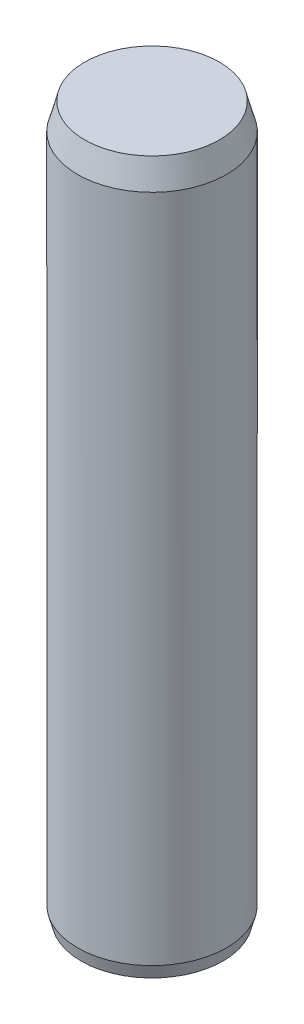
ISO-10303-21;
HEADER;
FILE_DESCRIPTION(('STEP AP214'),'2;1');
FILE_NAME('part.step','',(''),(''),'','','');
FILE_SCHEMA(('AUTOMOTIVE_DESIGN { 1 0 10303 214 1 1 1 1 }'));
ENDSEC;
DATA;
#1=APPLICATION_CONTEXT('core data for automotive mechanical design processes');
#2=APPLICATION_PROTOCOL_DEFINITION('international standard','automotive_design',2000,#1);
#3=PRODUCT_CONTEXT('',#1,'mechanical');
#4=PRODUCT('Part','Part','',(#3));
#5=PRODUCT_RELATED_PRODUCT_CATEGORY('part','',(#4));
#6=PRODUCT_DEFINITION_FORMATION('','',#4);
#7=PRODUCT_DEFINITION_CONTEXT('part definition',#1,'design');
#8=PRODUCT_DEFINITION('design','',#6,#7);
#9=PRODUCT_DEFINITION_SHAPE('','',#8);
#10=(LENGTH_UNIT() NAMED_UNIT(*) SI_UNIT(.MILLI.,.METRE.));
#11=(NAMED_UNIT(*) PLANE_ANGLE_UNIT() SI_UNIT($,.RADIAN.));
#12=(NAMED_UNIT(*) SI_UNIT($,.STERADIAN.) SOLID_ANGLE_UNIT());
#13=UNCERTAINTY_MEASURE_WITH_UNIT(LENGTH_MEASURE(1.E-05),#10,'distance_accuracy_value','');
#14=(GEOMETRIC_REPRESENTATION_CONTEXT(3) GLOBAL_UNCERTAINTY_ASSIGNED_CONTEXT((#13)) GLOBAL_UNIT_ASSIGNED_CONTEXT((#10,
#11,#12)) REPRESENTATION_CONTEXT('',''));
#15=CARTESIAN_POINT('',(0.,0.,0.));
#16=DIRECTION('',(0.,0.,1.));
#17=DIRECTION('',(1.,0.,0.));
#18=AXIS2_PLACEMENT_3D('',#15,#16,#17);
#19=CARTESIAN_POINT('',(0.,200.,0.));
#20=DIRECTION('',(0.,-1.,0.));
#21=DIRECTION('',(0.,0.,-1.));
#22=AXIS2_PLACEMENT_3D('',#19,#20,#21);
#23=CYLINDRICAL_SURFACE('',#22,21.);
#24=CARTESIAN_POINT('',(0.,3.73205080756916,0.));
#25=DIRECTION('',(0.,1.,0.));
#26=DIRECTION('',(0.,0.,1.));
#27=AXIS2_PLACEMENT_3D('',#24,#25,#26);
#28=CIRCLE('',#27,21.);
#29=CARTESIAN_POINT('',(0.,3.73205080756916,21.));
#30=VERTEX_POINT('',#29);
#31=EDGE_CURVE('E51',#30,#30,#28,.T.);
#32=ORIENTED_EDGE('',*,*,#31,.T.);
#33=EDGE_LOOP('',(#32));
#34=FACE_BOUND('',#33,.T.);
#35=CARTESIAN_POINT('',(0.,192.535898384862,0.));
#36=DIRECTION('',(0.,1.,0.));
#37=DIRECTION('',(0.,0.,1.));
#38=AXIS2_PLACEMENT_3D('',#35,#36,#37);
#39=CIRCLE('',#38,21.);
#40=CARTESIAN_POINT('',(0.,192.535898384862,-21.));
#41=VERTEX_POINT('',#40);
#42=EDGE_CURVE('E55',#41,#41,#39,.F.);
#43=ORIENTED_EDGE('',*,*,#42,.T.);
#44=EDGE_LOOP('',(#43));
#45=FACE_BOUND('',#44,.T.);
#46=ADVANCED_FACE('F43',(#34,#45),#23,.T.);
#47=CARTESIAN_POINT('',(0.,200.,0.));
#48=DIRECTION('',(0.,1.,0.));
#49=DIRECTION('',(0.,0.,1.));
#50=AXIS2_PLACEMENT_3D('',#47,#48,#49);
#51=PLANE('',#50);
#52=CARTESIAN_POINT('',(0.,200.,0.));
#53=DIRECTION('',(0.,1.,0.));
#54=DIRECTION('',(0.,0.,1.));
#55=AXIS2_PLACEMENT_3D('',#52,#53,#54);
#56=CIRCLE('',#55,19.);
#57=CARTESIAN_POINT('',(0.,200.,-19.));
#58=VERTEX_POINT('',#57);
#59=EDGE_CURVE('E59',#58,#58,#56,.T.);
#60=ORIENTED_EDGE('',*,*,#59,.T.);
#61=EDGE_LOOP('',(#60));
#62=FACE_BOUND('',#61,.T.);
#63=ADVANCED_FACE('F65',(#62),#51,.T.);
#64=CARTESIAN_POINT('',(0.,0.,0.));
#65=DIRECTION('',(0.,1.,0.));
#66=DIRECTION('',(0.,0.,1.));
#67=AXIS2_PLACEMENT_3D('',#64,#65,#66);
#68=PLANE('',#67);
#69=CARTESIAN_POINT('',(0.,0.,0.));
#70=DIRECTION('',(0.,1.,0.));
#71=DIRECTION('',(0.,0.,1.));
#72=AXIS2_PLACEMENT_3D('',#69,#70,#71);
#73=CIRCLE('',#72,19.9999999999999);
#74=CARTESIAN_POINT('',(0.,0.,19.9999999999999));
#75=VERTEX_POINT('',#74);
#76=EDGE_CURVE('E10',#75,#75,#73,.F.);
#77=ORIENTED_EDGE('',*,*,#76,.T.);
#78=EDGE_LOOP('',(#77));
#79=FACE_BOUND('',#78,.T.);
#80=ADVANCED_FACE('F69',(#79),#68,.F.);
#81=CARTESIAN_POINT('',(0.,200.,0.));
#82=DIRECTION('',(0.,-1.,0.));
#83=DIRECTION('',(0.,0.,-1.));
#84=AXIS2_PLACEMENT_3D('',#81,#82,#83);
#85=CONICAL_SURFACE('',#84,19.,0.261799387799146);
#86=CARTESIAN_POINT('',(0.,192.535898384862,-21.));
#87=CARTESIAN_POINT('',(0.,192.613649443353,-20.9791666666667));
#88=CARTESIAN_POINT('',(0.,192.691400501844,-20.9583333333333));
#89=CARTESIAN_POINT('',(0.,192.846902618826,-20.9166666666667));
#90=CARTESIAN_POINT('',(0.,192.924653677317,-20.8958333333333));
#91=CARTESIAN_POINT('',(0.,193.080155794299,-20.8541666666667));
#92=CARTESIAN_POINT('',(0.,193.15790685279,-20.8333333333333));
#93=CARTESIAN_POINT('',(0.,193.313408969772,-20.7916666666667));
#94=CARTESIAN_POINT('',(0.,193.391160028263,-20.7708333333333));
#95=CARTESIAN_POINT('',(0.,193.546662145245,-20.7291666666667));
#96=CARTESIAN_POINT('',(0.,193.624413203736,-20.7083333333333));
#97=CARTESIAN_POINT('',(0.,193.779915320719,-20.6666666666667));
#98=CARTESIAN_POINT('',(0.,193.85766637921,-20.6458333333333));
#99=CARTESIAN_POINT('',(0.,194.013168496192,-20.6041666666667));
#100=CARTESIAN_POINT('',(0.,194.090919554683,-20.5833333333333));
#101=CARTESIAN_POINT('',(0.,194.246421671665,-20.5416666666667));
#102=CARTESIAN_POINT('',(0.,194.324172730156,-20.5208333333333));
#103=CARTESIAN_POINT('',(0.,194.479674847138,-20.4791666666667));
#104=CARTESIAN_POINT('',(0.,194.557425905629,-20.4583333333333));
#105=CARTESIAN_POINT('',(0.,194.712928022611,-20.4166666666667));
#106=CARTESIAN_POINT('',(0.,194.790679081102,-20.3958333333333));
#107=CARTESIAN_POINT('',(0.,194.946181198084,-20.3541666666667));
#108=CARTESIAN_POINT('',(0.,195.023932256575,-20.3333333333333));
#109=CARTESIAN_POINT('',(0.,195.179434373557,-20.2916666666667));
#110=CARTESIAN_POINT('',(0.,195.257185432048,-20.2708333333333));
#111=CARTESIAN_POINT('',(0.,195.41268754903,-20.2291666666667));
#112=CARTESIAN_POINT('',(0.,195.490438607521,-20.2083333333333));
#113=CARTESIAN_POINT('',(0.,195.645940724503,-20.1666666666667));
#114=CARTESIAN_POINT('',(0.,195.723691782994,-20.1458333333333));
#115=CARTESIAN_POINT('',(0.,195.879193899976,-20.1041666666667));
#116=CARTESIAN_POINT('',(0.,195.956944958467,-20.0833333333333));
#117=CARTESIAN_POINT('',(0.,196.112447075449,-20.0416666666667));
#118=CARTESIAN_POINT('',(0.,196.19019813394,-20.0208333333333));
#119=CARTESIAN_POINT('',(0.,196.345700250922,-19.9791666666667));
#120=CARTESIAN_POINT('',(0.,196.423451309413,-19.9583333333334));
#121=CARTESIAN_POINT('',(0.,196.578953426395,-19.9166666666667));
#122=CARTESIAN_POINT('',(0.,196.656704484886,-19.8958333333333));
#123=CARTESIAN_POINT('',(0.,196.812206601868,-19.8541666666667));
#124=CARTESIAN_POINT('',(0.,196.889957660359,-19.8333333333334));
#125=CARTESIAN_POINT('',(0.,197.045459777341,-19.7916666666667));
#126=CARTESIAN_POINT('',(0.,197.123210835832,-19.7708333333334));
#127=CARTESIAN_POINT('',(0.,197.278712952814,-19.7291666666667));
#128=CARTESIAN_POINT('',(0.,197.356464011305,-19.7083333333334));
#129=CARTESIAN_POINT('',(0.,197.511966128287,-19.6666666666667));
#130=CARTESIAN_POINT('',(0.,197.589717186778,-19.6458333333334));
#131=CARTESIAN_POINT('',(0.,197.74521930376,-19.6041666666667));
#132=CARTESIAN_POINT('',(0.,197.822970362251,-19.5833333333334));
#133=CARTESIAN_POINT('',(0.,197.978472479234,-19.5416666666667));
#134=CARTESIAN_POINT('',(0.,198.056223537725,-19.5208333333334));
#135=CARTESIAN_POINT('',(0.,198.211725654707,-19.4791666666667));
#136=CARTESIAN_POINT('',(0.,198.289476713198,-19.4583333333334));
#137=CARTESIAN_POINT('',(0.,198.44497883018,-19.4166666666667));
#138=CARTESIAN_POINT('',(0.,198.522729888671,-19.3958333333334));
#139=CARTESIAN_POINT('',(0.,198.678232005653,-19.3541666666667));
#140=CARTESIAN_POINT('',(0.,198.755983064144,-19.3333333333334));
#141=CARTESIAN_POINT('',(0.,198.911485181126,-19.2916666666667));
#142=CARTESIAN_POINT('',(0.,198.989236239617,-19.2708333333334));
#143=CARTESIAN_POINT('',(0.,199.144738356599,-19.2291666666667));
#144=CARTESIAN_POINT('',(0.,199.22248941509,-19.2083333333334));
#145=CARTESIAN_POINT('',(0.,199.377991532072,-19.1666666666667));
#146=CARTESIAN_POINT('',(0.,199.455742590563,-19.1458333333334));
#147=CARTESIAN_POINT('',(0.,199.611244707545,-19.1041666666667));
#148=CARTESIAN_POINT('',(0.,199.688995766036,-19.0833333333334));
#149=CARTESIAN_POINT('',(0.,199.844497883018,-19.0416666666667));
#150=CARTESIAN_POINT('',(0.,199.922248941509,-19.0208333333334));
#151=CARTESIAN_POINT('',(0.,200.,-19.));
#152=B_SPLINE_CURVE_WITH_KNOTS('',3,(#86,#87,#88,#89,#90,#91,#92,#93,#94,#95,#96,#97,#98,#99,
#100,#101,#102,#103,#104,#105,#106,#107,#108,#109,#110,#111,#112,#113,#114,#115,#116,#117,#118,
#119,#120,#121,#122,#123,#124,#125,#126,#127,#128,#129,#130,#131,#132,#133,#134,#135,#136,#137,
#138,#139,#140,#141,#142,#143,#144,#145,#146,#147,#148,#149,#150,#151),.UNSPECIFIED.,.F.,.F.,(4,
2,2,2,2,2,2,2,2,2,2,2,2,2,2,2,2,2,2,2,2,2,2,2,2,2,2,2,2,2,2,2,4),(0.,0.241481456572281,
0.482962913144534,0.724444369716816,0.96592582628907,1.20740728286135,1.4488887394336,
1.69037019600589,1.93185165257814,2.17333310915042,2.41481456572268,2.65629602229496,
2.89777747886724,3.13925893543949,3.38074039201175,3.62222184858403,3.86370330515628,
4.10518476172856,4.34666621830082,4.5881476748731,4.82962913144535,5.07111058801763,
5.31259204458988,5.55407350116216,5.79555495773445,6.0370364143067,6.27851787087898,
6.51999932745123,6.76148078402352,7.00296224059577,7.24444369716805,7.4859251537403,
7.72740661031258),.UNSPECIFIED.);
#153=EDGE_CURVE('BSEAM67',#41,#58,#152,.T.);
#154=ORIENTED_EDGE('',*,*,#42,.F.);
#155=ORIENTED_EDGE('',*,*,#59,.F.);
#156=ORIENTED_EDGE('',*,*,#153,.T.);
#157=ORIENTED_EDGE('',*,*,#153,.F.);
#158=EDGE_LOOP('',(#154,#156,#155,#157));
#159=FACE_BOUND('',#158,.T.);
#160=ADVANCED_FACE('F67',(#159),#85,.T.);
#161=CARTESIAN_POINT('',(0.,3.73205080756916,0.));
#162=DIRECTION('',(0.,1.,0.));
#163=DIRECTION('',(0.,0.,1.));
#164=AXIS2_PLACEMENT_3D('',#161,#162,#163);
#165=CONICAL_SURFACE('',#164,21.,0.26179938779915);
#166=ORIENTED_EDGE('',*,*,#76,.F.);
#167=EDGE_LOOP('',(#166));
#168=FACE_BOUND('',#167,.T.);
#169=ORIENTED_EDGE('',*,*,#31,.F.);
#170=EDGE_LOOP('',(#169));
#171=FACE_BOUND('',#170,.T.);
#172=ADVANCED_FACE('F46',(#168,#171),#165,.T.);
#173=CLOSED_SHELL('',(#46,#63,#80,#160,#172));
#174=MANIFOLD_SOLID_BREP('B2',#173);
#175=ADVANCED_BREP_SHAPE_REPRESENTATION('',(#18,#174),#14);
#176=SHAPE_DEFINITION_REPRESENTATION(#9,#175);
ENDSEC;
END-ISO-10303-21;
